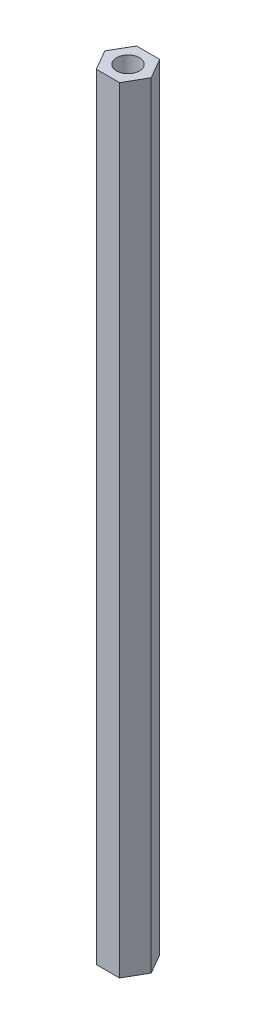
ISO-10303-21;
HEADER;
FILE_DESCRIPTION(('STEP AP214'),'2;1');
FILE_NAME('part.step','',(''),(''),'','','');
FILE_SCHEMA(('AUTOMOTIVE_DESIGN { 1 0 10303 214 1 1 1 1 }'));
ENDSEC;
DATA;
#1=APPLICATION_CONTEXT('core data for automotive mechanical design processes');
#2=APPLICATION_PROTOCOL_DEFINITION('international standard','automotive_design',2000,#1);
#3=PRODUCT_CONTEXT('',#1,'mechanical');
#4=PRODUCT('Part','Part','',(#3));
#5=PRODUCT_RELATED_PRODUCT_CATEGORY('part','',(#4));
#6=PRODUCT_DEFINITION_FORMATION('','',#4);
#7=PRODUCT_DEFINITION_CONTEXT('part definition',#1,'design');
#8=PRODUCT_DEFINITION('design','',#6,#7);
#9=PRODUCT_DEFINITION_SHAPE('','',#8);
#10=(LENGTH_UNIT() NAMED_UNIT(*) SI_UNIT(.MILLI.,.METRE.));
#11=(NAMED_UNIT(*) PLANE_ANGLE_UNIT() SI_UNIT($,.RADIAN.));
#12=(NAMED_UNIT(*) SI_UNIT($,.STERADIAN.) SOLID_ANGLE_UNIT());
#13=UNCERTAINTY_MEASURE_WITH_UNIT(LENGTH_MEASURE(1.E-05),#10,'distance_accuracy_value','');
#14=(GEOMETRIC_REPRESENTATION_CONTEXT(3) GLOBAL_UNCERTAINTY_ASSIGNED_CONTEXT((#13)) GLOBAL_UNIT_ASSIGNED_CONTEXT((#10,
#11,#12)) REPRESENTATION_CONTEXT('',''));
#15=CARTESIAN_POINT('',(0.,0.,0.));
#16=DIRECTION('',(0.,0.,1.));
#17=DIRECTION('',(1.,0.,0.));
#18=AXIS2_PLACEMENT_3D('',#15,#16,#17);
#19=CARTESIAN_POINT('',(0.,135.,0.));
#20=DIRECTION('',(0.,1.,0.));
#21=DIRECTION('',(0.,0.,1.));
#22=AXIS2_PLACEMENT_3D('',#19,#20,#21);
#23=PLANE('',#22);
#24=DIRECTION('',(-0.5,0.,-0.866025403784439));
#25=VECTOR('',#24,1.);
#26=CARTESIAN_POINT('',(4.04145188432738,135.,0.));
#27=LINE('',#26,#25);
#28=CARTESIAN_POINT('',(4.04145188432738,135.,0.));
#29=VERTEX_POINT('',#28);
#30=CARTESIAN_POINT('',(2.02072594216369,135.,-3.5));
#31=VERTEX_POINT('',#30);
#32=EDGE_CURVE('E152',#29,#31,#27,.T.);
#33=ORIENTED_EDGE('',*,*,#32,.T.);
#34=DIRECTION('',(-1.,0.,0.));
#35=VECTOR('',#34,1.);
#36=CARTESIAN_POINT('',(2.02072594216369,135.,-3.5));
#37=LINE('',#36,#35);
#38=CARTESIAN_POINT('',(-2.02072594216369,135.,-3.5));
#39=VERTEX_POINT('',#38);
#40=EDGE_CURVE('E100',#31,#39,#37,.T.);
#41=ORIENTED_EDGE('',*,*,#40,.T.);
#42=DIRECTION('',(-0.5,0.,0.866025403784439));
#43=VECTOR('',#42,1.);
#44=CARTESIAN_POINT('',(-2.02072594216369,135.,-3.5));
#45=LINE('',#44,#43);
#46=CARTESIAN_POINT('',(-4.04145188432738,135.,0.));
#47=VERTEX_POINT('',#46);
#48=EDGE_CURVE('E113',#39,#47,#45,.T.);
#49=ORIENTED_EDGE('',*,*,#48,.T.);
#50=DIRECTION('',(0.5,0.,0.866025403784438));
#51=VECTOR('',#50,1.);
#52=CARTESIAN_POINT('',(-4.04145188432738,135.,0.));
#53=LINE('',#52,#51);
#54=CARTESIAN_POINT('',(-2.02072594216369,135.,3.5));
#55=VERTEX_POINT('',#54);
#56=EDGE_CURVE('E107',#47,#55,#53,.T.);
#57=ORIENTED_EDGE('',*,*,#56,.T.);
#58=DIRECTION('',(1.,0.,0.));
#59=VECTOR('',#58,1.);
#60=CARTESIAN_POINT('',(-2.02072594216369,135.,3.5));
#61=LINE('',#60,#59);
#62=CARTESIAN_POINT('',(2.02072594216369,135.,3.5));
#63=VERTEX_POINT('',#62);
#64=EDGE_CURVE('E111',#55,#63,#61,.T.);
#65=ORIENTED_EDGE('',*,*,#64,.T.);
#66=DIRECTION('',(0.5,0.,-0.866025403784439));
#67=VECTOR('',#66,1.);
#68=CARTESIAN_POINT('',(2.02072594216369,135.,3.5));
#69=LINE('',#68,#67);
#70=EDGE_CURVE('E63',#63,#29,#69,.T.);
#71=ORIENTED_EDGE('',*,*,#70,.T.);
#72=EDGE_LOOP('',(#33,#41,#49,#57,#65,#71));
#73=FACE_BOUND('',#72,.T.);
#74=CARTESIAN_POINT('',(0.,135.,0.));
#75=DIRECTION('',(0.,1.,0.));
#76=DIRECTION('',(0.,0.,1.));
#77=AXIS2_PLACEMENT_3D('',#74,#75,#76);
#78=CIRCLE('',#77,2.);
#79=CARTESIAN_POINT('',(0.,135.,2.));
#80=VERTEX_POINT('',#79);
#81=EDGE_CURVE('E140',#80,#80,#78,.T.);
#82=ORIENTED_EDGE('',*,*,#81,.F.);
#83=EDGE_LOOP('',(#82));
#84=FACE_BOUND('',#83,.T.);
#85=ADVANCED_FACE('F45',(#73,#84),#23,.T.);
#86=CARTESIAN_POINT('',(0.,0.,0.));
#87=DIRECTION('',(0.,1.,0.));
#88=DIRECTION('',(0.,0.,1.));
#89=AXIS2_PLACEMENT_3D('',#86,#87,#88);
#90=PLANE('',#89);
#91=DIRECTION('',(-0.5,0.,-0.866025403784439));
#92=VECTOR('',#91,1.);
#93=CARTESIAN_POINT('',(4.04145188432738,0.,0.));
#94=LINE('',#93,#92);
#95=CARTESIAN_POINT('',(4.04145188432738,0.,0.));
#96=VERTEX_POINT('',#95);
#97=CARTESIAN_POINT('',(2.02072594216369,0.,-3.5));
#98=VERTEX_POINT('',#97);
#99=EDGE_CURVE('E135',#96,#98,#94,.T.);
#100=ORIENTED_EDGE('',*,*,#99,.F.);
#101=DIRECTION('',(0.5,0.,-0.866025403784439));
#102=VECTOR('',#101,1.);
#103=CARTESIAN_POINT('',(2.02072594216369,0.,3.5));
#104=LINE('',#103,#102);
#105=CARTESIAN_POINT('',(2.02072594216369,0.,3.5));
#106=VERTEX_POINT('',#105);
#107=EDGE_CURVE('E92',#106,#96,#104,.T.);
#108=ORIENTED_EDGE('',*,*,#107,.F.);
#109=DIRECTION('',(1.,0.,0.));
#110=VECTOR('',#109,1.);
#111=CARTESIAN_POINT('',(-2.02072594216369,0.,3.5));
#112=LINE('',#111,#110);
#113=CARTESIAN_POINT('',(-2.02072594216369,0.,3.5));
#114=VERTEX_POINT('',#113);
#115=EDGE_CURVE('E86',#114,#106,#112,.T.);
#116=ORIENTED_EDGE('',*,*,#115,.F.);
#117=DIRECTION('',(0.5,0.,0.866025403784438));
#118=VECTOR('',#117,1.);
#119=CARTESIAN_POINT('',(-4.04145188432738,0.,0.));
#120=LINE('',#119,#118);
#121=CARTESIAN_POINT('',(-4.04145188432738,0.,0.));
#122=VERTEX_POINT('',#121);
#123=EDGE_CURVE('E122',#122,#114,#120,.T.);
#124=ORIENTED_EDGE('',*,*,#123,.F.);
#125=DIRECTION('',(-0.5,0.,0.866025403784439));
#126=VECTOR('',#125,1.);
#127=CARTESIAN_POINT('',(-2.02072594216369,0.,-3.5));
#128=LINE('',#127,#126);
#129=CARTESIAN_POINT('',(-2.02072594216369,0.,-3.5));
#130=VERTEX_POINT('',#129);
#131=EDGE_CURVE('E143',#130,#122,#128,.T.);
#132=ORIENTED_EDGE('',*,*,#131,.F.);
#133=DIRECTION('',(-1.,0.,0.));
#134=VECTOR('',#133,1.);
#135=CARTESIAN_POINT('',(2.02072594216369,0.,-3.5));
#136=LINE('',#135,#134);
#137=EDGE_CURVE('E139',#98,#130,#136,.T.);
#138=ORIENTED_EDGE('',*,*,#137,.F.);
#139=EDGE_LOOP('',(#100,#108,#116,#124,#132,#138));
#140=FACE_BOUND('',#139,.T.);
#141=CARTESIAN_POINT('',(0.,0.,0.));
#142=DIRECTION('',(0.,1.,0.));
#143=DIRECTION('',(0.,0.,1.));
#144=AXIS2_PLACEMENT_3D('',#141,#142,#143);
#145=CIRCLE('',#144,2.);
#146=CARTESIAN_POINT('',(0.,0.,2.));
#147=VERTEX_POINT('',#146);
#148=EDGE_CURVE('E249',#147,#147,#145,.T.);
#149=ORIENTED_EDGE('',*,*,#148,.T.);
#150=EDGE_LOOP('',(#149));
#151=FACE_BOUND('',#150,.T.);
#152=ADVANCED_FACE('F165',(#140,#151),#90,.F.);
#153=CARTESIAN_POINT('',(4.04145188432738,135.,0.));
#154=DIRECTION('',(-0.866025403784439,0.,0.5));
#155=DIRECTION('',(0.5,0.,0.866025403784439));
#156=AXIS2_PLACEMENT_3D('',#153,#154,#155);
#157=PLANE('',#156);
#158=ORIENTED_EDGE('',*,*,#99,.T.);
#159=DIRECTION('',(0.,-1.,0.));
#160=VECTOR('',#159,1.);
#161=CARTESIAN_POINT('',(2.02072594216369,135.,-3.5));
#162=LINE('',#161,#160);
#163=EDGE_CURVE('E11',#31,#98,#162,.T.);
#164=ORIENTED_EDGE('',*,*,#163,.F.);
#165=ORIENTED_EDGE('',*,*,#32,.F.);
#166=DIRECTION('',(0.,-1.,0.));
#167=VECTOR('',#166,1.);
#168=CARTESIAN_POINT('',(4.04145188432738,135.,0.));
#169=LINE('',#168,#167);
#170=EDGE_CURVE('E131',#29,#96,#169,.T.);
#171=ORIENTED_EDGE('',*,*,#170,.T.);
#172=EDGE_LOOP('',(#158,#164,#165,#171));
#173=FACE_BOUND('',#172,.T.);
#174=ADVANCED_FACE('F47',(#173),#157,.F.);
#175=CARTESIAN_POINT('',(2.02072594216369,135.,-3.5));
#176=DIRECTION('',(0.,0.,1.));
#177=DIRECTION('',(1.,0.,0.));
#178=AXIS2_PLACEMENT_3D('',#175,#176,#177);
#179=PLANE('',#178);
#180=ORIENTED_EDGE('',*,*,#137,.T.);
#181=DIRECTION('',(0.,-1.,0.));
#182=VECTOR('',#181,1.);
#183=CARTESIAN_POINT('',(-2.02072594216369,135.,-3.5));
#184=LINE('',#183,#182);
#185=EDGE_CURVE('E55',#39,#130,#184,.T.);
#186=ORIENTED_EDGE('',*,*,#185,.F.);
#187=ORIENTED_EDGE('',*,*,#40,.F.);
#188=ORIENTED_EDGE('',*,*,#163,.T.);
#189=EDGE_LOOP('',(#180,#186,#187,#188));
#190=FACE_BOUND('',#189,.T.);
#191=ADVANCED_FACE('F190',(#190),#179,.F.);
#192=CARTESIAN_POINT('',(-2.02072594216369,135.,-3.5));
#193=DIRECTION('',(0.866025403784439,0.,0.5));
#194=DIRECTION('',(0.5,0.,-0.866025403784439));
#195=AXIS2_PLACEMENT_3D('',#192,#193,#194);
#196=PLANE('',#195);
#197=ORIENTED_EDGE('',*,*,#131,.T.);
#198=DIRECTION('',(0.,-1.,0.));
#199=VECTOR('',#198,1.);
#200=CARTESIAN_POINT('',(-4.04145188432738,135.,0.));
#201=LINE('',#200,#199);
#202=EDGE_CURVE('E124',#47,#122,#201,.T.);
#203=ORIENTED_EDGE('',*,*,#202,.F.);
#204=ORIENTED_EDGE('',*,*,#48,.F.);
#205=ORIENTED_EDGE('',*,*,#185,.T.);
#206=EDGE_LOOP('',(#197,#203,#204,#205));
#207=FACE_BOUND('',#206,.T.);
#208=ADVANCED_FACE('F162',(#207),#196,.F.);
#209=CARTESIAN_POINT('',(-4.04145188432738,135.,0.));
#210=DIRECTION('',(0.866025403784439,0.,-0.5));
#211=DIRECTION('',(-0.5,0.,-0.866025403784439));
#212=AXIS2_PLACEMENT_3D('',#209,#210,#211);
#213=PLANE('',#212);
#214=ORIENTED_EDGE('',*,*,#123,.T.);
#215=DIRECTION('',(0.,-1.,0.));
#216=VECTOR('',#215,1.);
#217=CARTESIAN_POINT('',(-2.02072594216369,135.,3.5));
#218=LINE('',#217,#216);
#219=EDGE_CURVE('E119',#55,#114,#218,.T.);
#220=ORIENTED_EDGE('',*,*,#219,.F.);
#221=ORIENTED_EDGE('',*,*,#56,.F.);
#222=ORIENTED_EDGE('',*,*,#202,.T.);
#223=EDGE_LOOP('',(#214,#220,#221,#222));
#224=FACE_BOUND('',#223,.T.);
#225=ADVANCED_FACE('F120',(#224),#213,.F.);
#226=CARTESIAN_POINT('',(-2.02072594216369,135.,3.5));
#227=DIRECTION('',(0.,0.,-1.));
#228=DIRECTION('',(-1.,0.,0.));
#229=AXIS2_PLACEMENT_3D('',#226,#227,#228);
#230=PLANE('',#229);
#231=ORIENTED_EDGE('',*,*,#115,.T.);
#232=DIRECTION('',(0.,-1.,0.));
#233=VECTOR('',#232,1.);
#234=CARTESIAN_POINT('',(2.02072594216369,135.,3.5));
#235=LINE('',#234,#233);
#236=EDGE_CURVE('E125',#63,#106,#235,.T.);
#237=ORIENTED_EDGE('',*,*,#236,.F.);
#238=ORIENTED_EDGE('',*,*,#64,.F.);
#239=ORIENTED_EDGE('',*,*,#219,.T.);
#240=EDGE_LOOP('',(#231,#237,#238,#239));
#241=FACE_BOUND('',#240,.T.);
#242=ADVANCED_FACE('F127',(#241),#230,.F.);
#243=CARTESIAN_POINT('',(2.02072594216369,135.,3.5));
#244=DIRECTION('',(-0.866025403784439,0.,-0.5));
#245=DIRECTION('',(-0.5,0.,0.866025403784439));
#246=AXIS2_PLACEMENT_3D('',#243,#244,#245);
#247=PLANE('',#246);
#248=ORIENTED_EDGE('',*,*,#107,.T.);
#249=ORIENTED_EDGE('',*,*,#170,.F.);
#250=ORIENTED_EDGE('',*,*,#70,.F.);
#251=ORIENTED_EDGE('',*,*,#236,.T.);
#252=EDGE_LOOP('',(#248,#249,#250,#251));
#253=FACE_BOUND('',#252,.T.);
#254=ADVANCED_FACE('F170',(#253),#247,.F.);
#255=CARTESIAN_POINT('',(0.,135.,0.));
#256=DIRECTION('',(0.,-1.,0.));
#257=DIRECTION('',(0.,0.,-1.));
#258=AXIS2_PLACEMENT_3D('',#255,#256,#257);
#259=CYLINDRICAL_SURFACE('',#258,2.);
#260=ORIENTED_EDGE('',*,*,#81,.T.);
#261=EDGE_LOOP('',(#260));
#262=FACE_BOUND('',#261,.T.);
#263=ORIENTED_EDGE('',*,*,#148,.F.);
#264=EDGE_LOOP('',(#263));
#265=FACE_BOUND('',#264,.T.);
#266=ADVANCED_FACE('F172',(#262,#265),#259,.F.);
#267=CLOSED_SHELL('',(#85,#152,#174,#191,#208,#225,#242,#254,#266));
#268=MANIFOLD_SOLID_BREP('B2',#267);
#269=ADVANCED_BREP_SHAPE_REPRESENTATION('',(#18,#268),#14);
#270=SHAPE_DEFINITION_REPRESENTATION(#9,#269);
ENDSEC;
END-ISO-10303-21;
